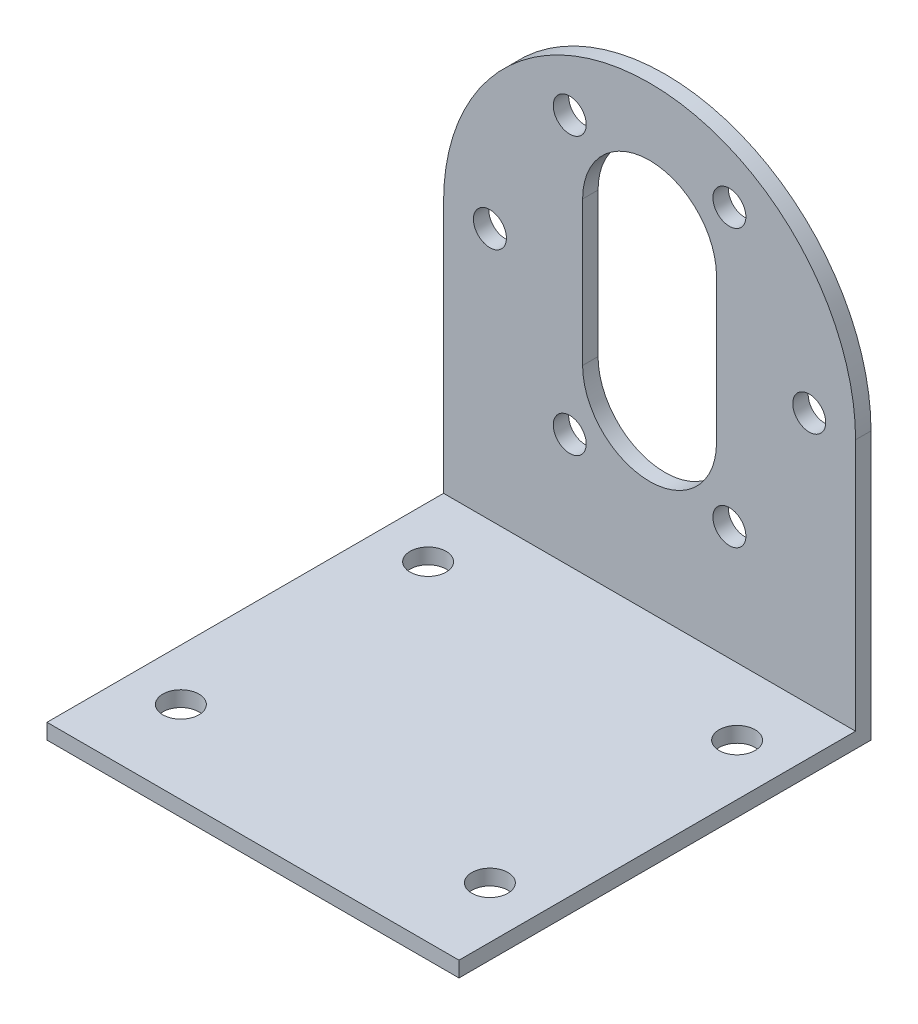
ISO-10303-21;
HEADER;
FILE_DESCRIPTION(('STEP AP214'),'2;1');
FILE_NAME('part.step','',(''),(''),'','','');
FILE_SCHEMA(('AUTOMOTIVE_DESIGN { 1 0 10303 214 1 1 1 1 }'));
ENDSEC;
DATA;
#1=APPLICATION_CONTEXT('core data for automotive mechanical design processes');
#2=APPLICATION_PROTOCOL_DEFINITION('international standard','automotive_design',2000,#1);
#3=PRODUCT_CONTEXT('',#1,'mechanical');
#4=PRODUCT('Part','Part','',(#3));
#5=PRODUCT_RELATED_PRODUCT_CATEGORY('part','',(#4));
#6=PRODUCT_DEFINITION_FORMATION('','',#4);
#7=PRODUCT_DEFINITION_CONTEXT('part definition',#1,'design');
#8=PRODUCT_DEFINITION('design','',#6,#7);
#9=PRODUCT_DEFINITION_SHAPE('','',#8);
#10=(LENGTH_UNIT() NAMED_UNIT(*) SI_UNIT(.MILLI.,.METRE.));
#11=(NAMED_UNIT(*) PLANE_ANGLE_UNIT() SI_UNIT($,.RADIAN.));
#12=(NAMED_UNIT(*) SI_UNIT($,.STERADIAN.) SOLID_ANGLE_UNIT());
#13=UNCERTAINTY_MEASURE_WITH_UNIT(LENGTH_MEASURE(1.E-05),#10,'distance_accuracy_value','');
#14=(GEOMETRIC_REPRESENTATION_CONTEXT(3) GLOBAL_UNCERTAINTY_ASSIGNED_CONTEXT((#13)) GLOBAL_UNIT_ASSIGNED_CONTEXT((#10,
#11,#12)) REPRESENTATION_CONTEXT('',''));
#15=CARTESIAN_POINT('',(0.,0.,0.));
#16=DIRECTION('',(0.,0.,1.));
#17=DIRECTION('',(1.,0.,0.));
#18=AXIS2_PLACEMENT_3D('',#15,#16,#17);
#19=CARTESIAN_POINT('',(0.,13.,1.5));
#20=DIRECTION('',(0.,0.,-1.));
#21=DIRECTION('',(-1.,0.,0.));
#22=AXIS2_PLACEMENT_3D('',#19,#20,#21);
#23=PLANE('',#22);
#24=CARTESIAN_POINT('',(-15.5,13.,1.5));
#25=DIRECTION('',(0.,0.,1.));
#26=DIRECTION('',(1.,0.,0.));
#27=AXIS2_PLACEMENT_3D('',#24,#25,#26);
#28=CIRCLE('',#27,1.6);
#29=CARTESIAN_POINT('',(-13.9,13.,1.5));
#30=VERTEX_POINT('',#29);
#31=EDGE_CURVE('E12',#30,#30,#28,.T.);
#32=ORIENTED_EDGE('',*,*,#31,.F.);
#33=EDGE_LOOP('',(#32));
#34=FACE_BOUND('',#33,.T.);
#35=CARTESIAN_POINT('',(-7.75,-0.423393758658798,1.5));
#36=DIRECTION('',(0.,0.,1.));
#37=DIRECTION('',(1.,0.,0.));
#38=AXIS2_PLACEMENT_3D('',#35,#36,#37);
#39=CIRCLE('',#38,1.6);
#40=CARTESIAN_POINT('',(-6.15,-0.423393758658798,1.5));
#41=VERTEX_POINT('',#40);
#42=EDGE_CURVE('E56',#41,#41,#39,.T.);
#43=ORIENTED_EDGE('',*,*,#42,.F.);
#44=EDGE_LOOP('',(#43));
#45=FACE_BOUND('',#44,.T.);
#46=CARTESIAN_POINT('',(7.75,-0.423393758658802,1.5));
#47=DIRECTION('',(0.,0.,1.));
#48=DIRECTION('',(1.,0.,0.));
#49=AXIS2_PLACEMENT_3D('',#46,#47,#48);
#50=CIRCLE('',#49,1.6);
#51=CARTESIAN_POINT('',(9.35000000000001,-0.423393758658802,1.5));
#52=VERTEX_POINT('',#51);
#53=EDGE_CURVE('E342',#52,#52,#50,.T.);
#54=ORIENTED_EDGE('',*,*,#53,.F.);
#55=EDGE_LOOP('',(#54));
#56=FACE_BOUND('',#55,.T.);
#57=CARTESIAN_POINT('',(15.5,13.,1.5));
#58=DIRECTION('',(0.,0.,1.));
#59=DIRECTION('',(1.,0.,0.));
#60=AXIS2_PLACEMENT_3D('',#57,#58,#59);
#61=CIRCLE('',#60,1.6);
#62=CARTESIAN_POINT('',(17.1,13.,1.5));
#63=VERTEX_POINT('',#62);
#64=EDGE_CURVE('E347',#63,#63,#61,.T.);
#65=ORIENTED_EDGE('',*,*,#64,.F.);
#66=EDGE_LOOP('',(#65));
#67=FACE_BOUND('',#66,.T.);
#68=CARTESIAN_POINT('',(7.75,26.4233937586588,1.5));
#69=DIRECTION('',(0.,0.,1.));
#70=DIRECTION('',(1.,0.,0.));
#71=AXIS2_PLACEMENT_3D('',#68,#69,#70);
#72=CIRCLE('',#71,1.6);
#73=CARTESIAN_POINT('',(9.35,26.4233937586588,1.5));
#74=VERTEX_POINT('',#73);
#75=EDGE_CURVE('E238',#74,#74,#72,.T.);
#76=ORIENTED_EDGE('',*,*,#75,.F.);
#77=EDGE_LOOP('',(#76));
#78=FACE_BOUND('',#77,.T.);
#79=CARTESIAN_POINT('',(-7.75,26.4233937586588,1.5));
#80=DIRECTION('',(0.,0.,1.));
#81=DIRECTION('',(1.,0.,0.));
#82=AXIS2_PLACEMENT_3D('',#79,#80,#81);
#83=CIRCLE('',#82,1.6);
#84=CARTESIAN_POINT('',(-6.15,26.4233937586588,1.5));
#85=VERTEX_POINT('',#84);
#86=EDGE_CURVE('E234',#85,#85,#83,.T.);
#87=ORIENTED_EDGE('',*,*,#86,.F.);
#88=EDGE_LOOP('',(#87));
#89=FACE_BOUND('',#88,.T.);
#90=DIRECTION('',(0.,-1.,0.));
#91=VECTOR('',#90,1.);
#92=CARTESIAN_POINT('',(-20.,13.,1.5));
#93=LINE('',#92,#91);
#94=CARTESIAN_POINT('',(-20.,13.,1.5));
#95=VERTEX_POINT('',#94);
#96=CARTESIAN_POINT('',(-20.,-11.5,1.5));
#97=VERTEX_POINT('',#96);
#98=EDGE_CURVE('E63',#95,#97,#93,.T.);
#99=ORIENTED_EDGE('',*,*,#98,.T.);
#100=DIRECTION('',(1.,0.,0.));
#101=VECTOR('',#100,1.);
#102=CARTESIAN_POINT('',(0.,-11.5,1.5));
#103=LINE('',#102,#101);
#104=CARTESIAN_POINT('',(20.,-11.5,1.5));
#105=VERTEX_POINT('',#104);
#106=EDGE_CURVE('E68',#97,#105,#103,.T.);
#107=ORIENTED_EDGE('',*,*,#106,.T.);
#108=DIRECTION('',(0.,1.,0.));
#109=VECTOR('',#108,1.);
#110=CARTESIAN_POINT('',(20.,13.,1.5));
#111=LINE('',#110,#109);
#112=CARTESIAN_POINT('',(20.,13.,1.5));
#113=VERTEX_POINT('',#112);
#114=EDGE_CURVE('E132',#105,#113,#111,.T.);
#115=ORIENTED_EDGE('',*,*,#114,.T.);
#116=CARTESIAN_POINT('',(0.,13.,1.5));
#117=DIRECTION('',(0.,0.,1.));
#118=DIRECTION('',(-1.,0.,0.));
#119=AXIS2_PLACEMENT_3D('',#116,#117,#118);
#120=CIRCLE('',#119,20.);
#121=EDGE_CURVE('E185',#113,#95,#120,.T.);
#122=ORIENTED_EDGE('',*,*,#121,.T.);
#123=EDGE_LOOP('',(#99,#107,#115,#122));
#124=FACE_BOUND('',#123,.T.);
#125=CARTESIAN_POINT('',(0.,6.,1.5));
#126=DIRECTION('',(0.,0.,1.));
#127=DIRECTION('',(-1.,0.,0.));
#128=AXIS2_PLACEMENT_3D('',#125,#126,#127);
#129=CIRCLE('',#128,6.5);
#130=CARTESIAN_POINT('',(-6.5,6.,1.5));
#131=VERTEX_POINT('',#130);
#132=CARTESIAN_POINT('',(6.5,6.,1.5));
#133=VERTEX_POINT('',#132);
#134=EDGE_CURVE('E250',#131,#133,#129,.T.);
#135=ORIENTED_EDGE('',*,*,#134,.F.);
#136=DIRECTION('',(0.,-1.,0.));
#137=VECTOR('',#136,1.);
#138=CARTESIAN_POINT('',(-6.5,20.,1.5));
#139=LINE('',#138,#137);
#140=CARTESIAN_POINT('',(-6.5,20.,1.5));
#141=VERTEX_POINT('',#140);
#142=EDGE_CURVE('E255',#141,#131,#139,.T.);
#143=ORIENTED_EDGE('',*,*,#142,.F.);
#144=CARTESIAN_POINT('',(0.,20.,1.5));
#145=DIRECTION('',(0.,0.,1.));
#146=DIRECTION('',(-1.,0.,0.));
#147=AXIS2_PLACEMENT_3D('',#144,#145,#146);
#148=CIRCLE('',#147,6.5);
#149=CARTESIAN_POINT('',(6.5,20.,1.5));
#150=VERTEX_POINT('',#149);
#151=EDGE_CURVE('E259',#150,#141,#148,.T.);
#152=ORIENTED_EDGE('',*,*,#151,.F.);
#153=DIRECTION('',(0.,1.,0.));
#154=VECTOR('',#153,1.);
#155=CARTESIAN_POINT('',(6.5,20.,1.5));
#156=LINE('',#155,#154);
#157=EDGE_CURVE('E263',#133,#150,#156,.T.);
#158=ORIENTED_EDGE('',*,*,#157,.F.);
#159=EDGE_LOOP('',(#135,#143,#152,#158));
#160=FACE_BOUND('',#159,.T.);
#161=ADVANCED_FACE('F47',(#34,#45,#56,#67,#78,#89,#124,#160),#23,.F.);
#162=CARTESIAN_POINT('',(0.,13.,0.));
#163=DIRECTION('',(0.,0.,-1.));
#164=DIRECTION('',(-1.,0.,0.));
#165=AXIS2_PLACEMENT_3D('',#162,#163,#164);
#166=PLANE('',#165);
#167=CARTESIAN_POINT('',(0.,13.,0.));
#168=DIRECTION('',(0.,0.,1.));
#169=DIRECTION('',(-1.,0.,0.));
#170=AXIS2_PLACEMENT_3D('',#167,#168,#169);
#171=CIRCLE('',#170,20.);
#172=CARTESIAN_POINT('',(20.,13.,0.));
#173=VERTEX_POINT('',#172);
#174=CARTESIAN_POINT('',(-20.,13.,0.));
#175=VERTEX_POINT('',#174);
#176=EDGE_CURVE('E266',#173,#175,#171,.T.);
#177=ORIENTED_EDGE('',*,*,#176,.F.);
#178=DIRECTION('',(0.,1.,0.));
#179=VECTOR('',#178,1.);
#180=CARTESIAN_POINT('',(20.,13.,0.));
#181=LINE('',#180,#179);
#182=CARTESIAN_POINT('',(20.,-13.,0.));
#183=VERTEX_POINT('',#182);
#184=EDGE_CURVE('E271',#183,#173,#181,.T.);
#185=ORIENTED_EDGE('',*,*,#184,.F.);
#186=DIRECTION('',(1.,0.,0.));
#187=VECTOR('',#186,1.);
#188=CARTESIAN_POINT('',(20.,-13.,0.));
#189=LINE('',#188,#187);
#190=CARTESIAN_POINT('',(-20.,-13.,0.));
#191=VERTEX_POINT('',#190);
#192=EDGE_CURVE('E322',#191,#183,#189,.T.);
#193=ORIENTED_EDGE('',*,*,#192,.F.);
#194=DIRECTION('',(0.,-1.,0.));
#195=VECTOR('',#194,1.);
#196=CARTESIAN_POINT('',(-20.,13.,0.));
#197=LINE('',#196,#195);
#198=EDGE_CURVE('E286',#175,#191,#197,.T.);
#199=ORIENTED_EDGE('',*,*,#198,.F.);
#200=EDGE_LOOP('',(#177,#185,#193,#199));
#201=FACE_BOUND('',#200,.T.);
#202=CARTESIAN_POINT('',(-7.75,-0.423393758658798,0.));
#203=DIRECTION('',(0.,0.,1.));
#204=DIRECTION('',(1.,0.,0.));
#205=AXIS2_PLACEMENT_3D('',#202,#203,#204);
#206=CIRCLE('',#205,1.6);
#207=CARTESIAN_POINT('',(-6.15,-0.423393758658798,0.));
#208=VERTEX_POINT('',#207);
#209=EDGE_CURVE('E281',#208,#208,#206,.T.);
#210=ORIENTED_EDGE('',*,*,#209,.T.);
#211=EDGE_LOOP('',(#210));
#212=FACE_BOUND('',#211,.T.);
#213=CARTESIAN_POINT('',(15.5,13.,0.));
#214=DIRECTION('',(0.,0.,1.));
#215=DIRECTION('',(1.,0.,0.));
#216=AXIS2_PLACEMENT_3D('',#213,#214,#215);
#217=CIRCLE('',#216,1.6);
#218=CARTESIAN_POINT('',(17.1,13.,0.));
#219=VERTEX_POINT('',#218);
#220=EDGE_CURVE('E287',#219,#219,#217,.T.);
#221=ORIENTED_EDGE('',*,*,#220,.T.);
#222=EDGE_LOOP('',(#221));
#223=FACE_BOUND('',#222,.T.);
#224=CARTESIAN_POINT('',(-7.75,26.4233937586588,0.));
#225=DIRECTION('',(0.,0.,1.));
#226=DIRECTION('',(1.,0.,0.));
#227=AXIS2_PLACEMENT_3D('',#224,#225,#226);
#228=CIRCLE('',#227,1.6);
#229=CARTESIAN_POINT('',(-6.15,26.4233937586588,0.));
#230=VERTEX_POINT('',#229);
#231=EDGE_CURVE('E297',#230,#230,#228,.T.);
#232=ORIENTED_EDGE('',*,*,#231,.T.);
#233=EDGE_LOOP('',(#232));
#234=FACE_BOUND('',#233,.T.);
#235=CARTESIAN_POINT('',(7.75,26.4233937586588,0.));
#236=DIRECTION('',(0.,0.,1.));
#237=DIRECTION('',(1.,0.,0.));
#238=AXIS2_PLACEMENT_3D('',#235,#236,#237);
#239=CIRCLE('',#238,1.6);
#240=CARTESIAN_POINT('',(9.35,26.4233937586588,0.));
#241=VERTEX_POINT('',#240);
#242=EDGE_CURVE('E301',#241,#241,#239,.T.);
#243=ORIENTED_EDGE('',*,*,#242,.T.);
#244=EDGE_LOOP('',(#243));
#245=FACE_BOUND('',#244,.T.);
#246=CARTESIAN_POINT('',(7.75,-0.423393758658802,0.));
#247=DIRECTION('',(0.,0.,1.));
#248=DIRECTION('',(1.,0.,0.));
#249=AXIS2_PLACEMENT_3D('',#246,#247,#248);
#250=CIRCLE('',#249,1.6);
#251=CARTESIAN_POINT('',(9.35000000000001,-0.423393758658802,0.));
#252=VERTEX_POINT('',#251);
#253=EDGE_CURVE('E309',#252,#252,#250,.T.);
#254=ORIENTED_EDGE('',*,*,#253,.T.);
#255=EDGE_LOOP('',(#254));
#256=FACE_BOUND('',#255,.T.);
#257=CARTESIAN_POINT('',(-15.5,13.,0.));
#258=DIRECTION('',(0.,0.,1.));
#259=DIRECTION('',(1.,0.,0.));
#260=AXIS2_PLACEMENT_3D('',#257,#258,#259);
#261=CIRCLE('',#260,1.6);
#262=CARTESIAN_POINT('',(-13.9,13.,0.));
#263=VERTEX_POINT('',#262);
#264=EDGE_CURVE('E313',#263,#263,#261,.T.);
#265=ORIENTED_EDGE('',*,*,#264,.T.);
#266=EDGE_LOOP('',(#265));
#267=FACE_BOUND('',#266,.T.);
#268=DIRECTION('',(0.,-1.,0.));
#269=VECTOR('',#268,1.);
#270=CARTESIAN_POINT('',(-6.5,20.,0.));
#271=LINE('',#270,#269);
#272=CARTESIAN_POINT('',(-6.5,20.,0.));
#273=VERTEX_POINT('',#272);
#274=CARTESIAN_POINT('',(-6.5,6.,0.));
#275=VERTEX_POINT('',#274);
#276=EDGE_CURVE('E205',#273,#275,#271,.T.);
#277=ORIENTED_EDGE('',*,*,#276,.T.);
#278=CARTESIAN_POINT('',(0.,6.,0.));
#279=DIRECTION('',(0.,0.,1.));
#280=DIRECTION('',(-1.,0.,0.));
#281=AXIS2_PLACEMENT_3D('',#278,#279,#280);
#282=CIRCLE('',#281,6.5);
#283=CARTESIAN_POINT('',(6.5,6.,0.));
#284=VERTEX_POINT('',#283);
#285=EDGE_CURVE('E197',#275,#284,#282,.T.);
#286=ORIENTED_EDGE('',*,*,#285,.T.);
#287=DIRECTION('',(0.,1.,0.));
#288=VECTOR('',#287,1.);
#289=CARTESIAN_POINT('',(6.5,20.,0.));
#290=LINE('',#289,#288);
#291=CARTESIAN_POINT('',(6.5,20.,0.));
#292=VERTEX_POINT('',#291);
#293=EDGE_CURVE('E193',#284,#292,#290,.T.);
#294=ORIENTED_EDGE('',*,*,#293,.T.);
#295=CARTESIAN_POINT('',(0.,20.,0.));
#296=DIRECTION('',(0.,0.,1.));
#297=DIRECTION('',(-1.,0.,0.));
#298=AXIS2_PLACEMENT_3D('',#295,#296,#297);
#299=CIRCLE('',#298,6.5);
#300=EDGE_CURVE('E198',#292,#273,#299,.T.);
#301=ORIENTED_EDGE('',*,*,#300,.T.);
#302=EDGE_LOOP('',(#277,#286,#294,#301));
#303=FACE_BOUND('',#302,.T.);
#304=ADVANCED_FACE('F369',(#201,#212,#223,#234,#245,#256,#267,#303),#166,.T.);
#305=CARTESIAN_POINT('',(-20.,13.,1.5));
#306=DIRECTION('',(1.,0.,0.));
#307=DIRECTION('',(0.,1.,0.));
#308=AXIS2_PLACEMENT_3D('',#305,#306,#307);
#309=PLANE('',#308);
#310=ORIENTED_EDGE('',*,*,#198,.T.);
#311=DIRECTION('',(0.,0.,-1.));
#312=VECTOR('',#311,1.);
#313=CARTESIAN_POINT('',(-20.,-13.,1.5));
#314=LINE('',#313,#312);
#315=CARTESIAN_POINT('',(-20.,-13.,40.));
#316=VERTEX_POINT('',#315);
#317=EDGE_CURVE('E516',#316,#191,#314,.T.);
#318=ORIENTED_EDGE('',*,*,#317,.F.);
#319=DIRECTION('',(0.,-1.,0.));
#320=VECTOR('',#319,1.);
#321=CARTESIAN_POINT('',(-20.,-11.5,40.));
#322=LINE('',#321,#320);
#323=CARTESIAN_POINT('',(-20.,-11.5,40.));
#324=VERTEX_POINT('',#323);
#325=EDGE_CURVE('E524',#324,#316,#322,.T.);
#326=ORIENTED_EDGE('',*,*,#325,.F.);
#327=DIRECTION('',(0.,0.,-1.));
#328=VECTOR('',#327,1.);
#329=CARTESIAN_POINT('',(-20.,-11.5,0.));
#330=LINE('',#329,#328);
#331=EDGE_CURVE('E141',#324,#97,#330,.T.);
#332=ORIENTED_EDGE('',*,*,#331,.T.);
#333=ORIENTED_EDGE('',*,*,#98,.F.);
#334=DIRECTION('',(0.,0.,-1.));
#335=VECTOR('',#334,1.);
#336=CARTESIAN_POINT('',(-20.,13.,1.5));
#337=LINE('',#336,#335);
#338=EDGE_CURVE('E538',#95,#175,#337,.T.);
#339=ORIENTED_EDGE('',*,*,#338,.T.);
#340=EDGE_LOOP('',(#310,#318,#326,#332,#333,#339));
#341=FACE_BOUND('',#340,.T.);
#342=ADVANCED_FACE('F460',(#341),#309,.F.);
#343=CARTESIAN_POINT('',(20.,-13.,1.5));
#344=DIRECTION('',(0.,1.,0.));
#345=DIRECTION('',(-1.,0.,0.));
#346=AXIS2_PLACEMENT_3D('',#343,#344,#345);
#347=PLANE('',#346);
#348=CARTESIAN_POINT('',(-15.,-13.,8.));
#349=DIRECTION('',(0.,-1.,0.));
#350=DIRECTION('',(0.,0.,-1.));
#351=AXIS2_PLACEMENT_3D('',#348,#349,#350);
#352=CIRCLE('',#351,1.74999999999999);
#353=CARTESIAN_POINT('',(-15.,-13.,6.25000000000001));
#354=VERTEX_POINT('',#353);
#355=EDGE_CURVE('E1058',#354,#354,#352,.T.);
#356=ORIENTED_EDGE('',*,*,#355,.F.);
#357=EDGE_LOOP('',(#356));
#358=FACE_BOUND('',#357,.T.);
#359=ORIENTED_EDGE('',*,*,#192,.T.);
#360=DIRECTION('',(0.,0.,-1.));
#361=VECTOR('',#360,1.);
#362=CARTESIAN_POINT('',(20.,-13.,1.5));
#363=LINE('',#362,#361);
#364=CARTESIAN_POINT('',(20.,-13.,40.));
#365=VERTEX_POINT('',#364);
#366=EDGE_CURVE('E220',#365,#183,#363,.T.);
#367=ORIENTED_EDGE('',*,*,#366,.F.);
#368=DIRECTION('',(-1.,0.,0.));
#369=VECTOR('',#368,1.);
#370=CARTESIAN_POINT('',(-20.,-13.,40.));
#371=LINE('',#370,#369);
#372=EDGE_CURVE('E150',#365,#316,#371,.T.);
#373=ORIENTED_EDGE('',*,*,#372,.T.);
#374=ORIENTED_EDGE('',*,*,#317,.T.);
#375=EDGE_LOOP('',(#359,#367,#373,#374));
#376=FACE_BOUND('',#375,.T.);
#377=CARTESIAN_POINT('',(15.,-13.,8.));
#378=DIRECTION('',(0.,-1.,0.));
#379=DIRECTION('',(1.,0.,0.));
#380=AXIS2_PLACEMENT_3D('',#377,#378,#379);
#381=CIRCLE('',#380,1.75);
#382=CARTESIAN_POINT('',(16.75,-13.,8.));
#383=VERTEX_POINT('',#382);
#384=EDGE_CURVE('E221',#383,#383,#381,.T.);
#385=ORIENTED_EDGE('',*,*,#384,.F.);
#386=EDGE_LOOP('',(#385));
#387=FACE_BOUND('',#386,.T.);
#388=CARTESIAN_POINT('',(15.,-13.,32.));
#389=DIRECTION('',(0.,-1.,0.));
#390=DIRECTION('',(1.,0.,0.));
#391=AXIS2_PLACEMENT_3D('',#388,#389,#390);
#392=CIRCLE('',#391,1.75);
#393=CARTESIAN_POINT('',(16.75,-13.,32.));
#394=VERTEX_POINT('',#393);
#395=EDGE_CURVE('E166',#394,#394,#392,.T.);
#396=ORIENTED_EDGE('',*,*,#395,.F.);
#397=EDGE_LOOP('',(#396));
#398=FACE_BOUND('',#397,.T.);
#399=CARTESIAN_POINT('',(-15.,-13.,32.));
#400=DIRECTION('',(0.,-1.,0.));
#401=DIRECTION('',(1.,0.,0.));
#402=AXIS2_PLACEMENT_3D('',#399,#400,#401);
#403=CIRCLE('',#402,1.75);
#404=CARTESIAN_POINT('',(-13.25,-13.,32.));
#405=VERTEX_POINT('',#404);
#406=EDGE_CURVE('E135',#405,#405,#403,.T.);
#407=ORIENTED_EDGE('',*,*,#406,.F.);
#408=EDGE_LOOP('',(#407));
#409=FACE_BOUND('',#408,.T.);
#410=ADVANCED_FACE('F457',(#358,#376,#387,#398,#409),#347,.F.);
#411=CARTESIAN_POINT('',(20.,13.,1.5));
#412=DIRECTION('',(-1.,0.,0.));
#413=DIRECTION('',(0.,-1.,0.));
#414=AXIS2_PLACEMENT_3D('',#411,#412,#413);
#415=PLANE('',#414);
#416=ORIENTED_EDGE('',*,*,#114,.F.);
#417=DIRECTION('',(0.,0.,1.));
#418=VECTOR('',#417,1.);
#419=CARTESIAN_POINT('',(20.,-11.5,0.));
#420=LINE('',#419,#418);
#421=CARTESIAN_POINT('',(20.,-11.5,40.));
#422=VERTEX_POINT('',#421);
#423=EDGE_CURVE('E124',#105,#422,#420,.T.);
#424=ORIENTED_EDGE('',*,*,#423,.T.);
#425=DIRECTION('',(0.,-1.,0.));
#426=VECTOR('',#425,1.);
#427=CARTESIAN_POINT('',(20.,-11.5,40.));
#428=LINE('',#427,#426);
#429=EDGE_CURVE('E129',#422,#365,#428,.T.);
#430=ORIENTED_EDGE('',*,*,#429,.T.);
#431=ORIENTED_EDGE('',*,*,#366,.T.);
#432=ORIENTED_EDGE('',*,*,#184,.T.);
#433=DIRECTION('',(0.,0.,-1.));
#434=VECTOR('',#433,1.);
#435=CARTESIAN_POINT('',(20.,13.,1.5));
#436=LINE('',#435,#434);
#437=EDGE_CURVE('E152',#113,#173,#436,.T.);
#438=ORIENTED_EDGE('',*,*,#437,.F.);
#439=EDGE_LOOP('',(#416,#424,#430,#431,#432,#438));
#440=FACE_BOUND('',#439,.T.);
#441=ADVANCED_FACE('F126',(#440),#415,.F.);
#442=CARTESIAN_POINT('',(0.,13.,1.5));
#443=DIRECTION('',(0.,0.,-1.));
#444=DIRECTION('',(-1.,0.,0.));
#445=AXIS2_PLACEMENT_3D('',#442,#443,#444);
#446=CYLINDRICAL_SURFACE('',#445,20.);
#447=ORIENTED_EDGE('',*,*,#176,.T.);
#448=ORIENTED_EDGE('',*,*,#338,.F.);
#449=ORIENTED_EDGE('',*,*,#121,.F.);
#450=ORIENTED_EDGE('',*,*,#437,.T.);
#451=EDGE_LOOP('',(#447,#448,#449,#450));
#452=FACE_BOUND('',#451,.T.);
#453=ADVANCED_FACE('F450',(#452),#446,.T.);
#454=CARTESIAN_POINT('',(-7.75,26.4233937586588,1.5));
#455=DIRECTION('',(0.,0.,-1.));
#456=DIRECTION('',(-1.,0.,0.));
#457=AXIS2_PLACEMENT_3D('',#454,#455,#456);
#458=CYLINDRICAL_SURFACE('',#457,1.6);
#459=ORIENTED_EDGE('',*,*,#86,.T.);
#460=EDGE_LOOP('',(#459));
#461=FACE_BOUND('',#460,.T.);
#462=ORIENTED_EDGE('',*,*,#231,.F.);
#463=EDGE_LOOP('',(#462));
#464=FACE_BOUND('',#463,.T.);
#465=ADVANCED_FACE('F447',(#461,#464),#458,.F.);
#466=CARTESIAN_POINT('',(7.75,26.4233937586588,1.5));
#467=DIRECTION('',(0.,0.,-1.));
#468=DIRECTION('',(-1.,0.,0.));
#469=AXIS2_PLACEMENT_3D('',#466,#467,#468);
#470=CYLINDRICAL_SURFACE('',#469,1.6);
#471=ORIENTED_EDGE('',*,*,#75,.T.);
#472=EDGE_LOOP('',(#471));
#473=FACE_BOUND('',#472,.T.);
#474=ORIENTED_EDGE('',*,*,#242,.F.);
#475=EDGE_LOOP('',(#474));
#476=FACE_BOUND('',#475,.T.);
#477=ADVANCED_FACE('F364',(#473,#476),#470,.F.);
#478=CARTESIAN_POINT('',(15.5,13.,1.5));
#479=DIRECTION('',(0.,0.,-1.));
#480=DIRECTION('',(-1.,0.,0.));
#481=AXIS2_PLACEMENT_3D('',#478,#479,#480);
#482=CYLINDRICAL_SURFACE('',#481,1.6);
#483=ORIENTED_EDGE('',*,*,#64,.T.);
#484=EDGE_LOOP('',(#483));
#485=FACE_BOUND('',#484,.T.);
#486=ORIENTED_EDGE('',*,*,#220,.F.);
#487=EDGE_LOOP('',(#486));
#488=FACE_BOUND('',#487,.T.);
#489=ADVANCED_FACE('F441',(#485,#488),#482,.F.);
#490=CARTESIAN_POINT('',(7.75,-0.423393758658802,1.5));
#491=DIRECTION('',(0.,0.,-1.));
#492=DIRECTION('',(-1.,0.,0.));
#493=AXIS2_PLACEMENT_3D('',#490,#491,#492);
#494=CYLINDRICAL_SURFACE('',#493,1.6);
#495=ORIENTED_EDGE('',*,*,#53,.T.);
#496=EDGE_LOOP('',(#495));
#497=FACE_BOUND('',#496,.T.);
#498=ORIENTED_EDGE('',*,*,#253,.F.);
#499=EDGE_LOOP('',(#498));
#500=FACE_BOUND('',#499,.T.);
#501=ADVANCED_FACE('F434',(#497,#500),#494,.F.);
#502=CARTESIAN_POINT('',(-7.75,-0.423393758658798,1.5));
#503=DIRECTION('',(0.,0.,-1.));
#504=DIRECTION('',(-1.,0.,0.));
#505=AXIS2_PLACEMENT_3D('',#502,#503,#504);
#506=CYLINDRICAL_SURFACE('',#505,1.6);
#507=ORIENTED_EDGE('',*,*,#42,.T.);
#508=EDGE_LOOP('',(#507));
#509=FACE_BOUND('',#508,.T.);
#510=ORIENTED_EDGE('',*,*,#209,.F.);
#511=EDGE_LOOP('',(#510));
#512=FACE_BOUND('',#511,.T.);
#513=ADVANCED_FACE('F426',(#509,#512),#506,.F.);
#514=CARTESIAN_POINT('',(-15.5,13.,1.5));
#515=DIRECTION('',(0.,0.,-1.));
#516=DIRECTION('',(-1.,0.,0.));
#517=AXIS2_PLACEMENT_3D('',#514,#515,#516);
#518=CYLINDRICAL_SURFACE('',#517,1.6);
#519=ORIENTED_EDGE('',*,*,#31,.T.);
#520=EDGE_LOOP('',(#519));
#521=FACE_BOUND('',#520,.T.);
#522=ORIENTED_EDGE('',*,*,#264,.F.);
#523=EDGE_LOOP('',(#522));
#524=FACE_BOUND('',#523,.T.);
#525=ADVANCED_FACE('F424',(#521,#524),#518,.F.);
#526=CARTESIAN_POINT('',(0.,6.,1.5));
#527=DIRECTION('',(0.,0.,-1.));
#528=DIRECTION('',(-1.,0.,0.));
#529=AXIS2_PLACEMENT_3D('',#526,#527,#528);
#530=CYLINDRICAL_SURFACE('',#529,6.5);
#531=ORIENTED_EDGE('',*,*,#285,.F.);
#532=DIRECTION('',(0.,0.,-1.));
#533=VECTOR('',#532,1.);
#534=CARTESIAN_POINT('',(-6.5,6.,1.5));
#535=LINE('',#534,#533);
#536=EDGE_CURVE('E158',#131,#275,#535,.T.);
#537=ORIENTED_EDGE('',*,*,#536,.F.);
#538=ORIENTED_EDGE('',*,*,#134,.T.);
#539=DIRECTION('',(0.,0.,-1.));
#540=VECTOR('',#539,1.);
#541=CARTESIAN_POINT('',(6.5,6.,1.5));
#542=LINE('',#541,#540);
#543=EDGE_CURVE('E383',#133,#284,#542,.T.);
#544=ORIENTED_EDGE('',*,*,#543,.T.);
#545=EDGE_LOOP('',(#531,#537,#538,#544));
#546=FACE_BOUND('',#545,.T.);
#547=ADVANCED_FACE('F379',(#546),#530,.F.);
#548=CARTESIAN_POINT('',(6.5,20.,1.5));
#549=DIRECTION('',(-1.,0.,0.));
#550=DIRECTION('',(0.,-1.,0.));
#551=AXIS2_PLACEMENT_3D('',#548,#549,#550);
#552=PLANE('',#551);
#553=ORIENTED_EDGE('',*,*,#293,.F.);
#554=ORIENTED_EDGE('',*,*,#543,.F.);
#555=ORIENTED_EDGE('',*,*,#157,.T.);
#556=DIRECTION('',(0.,0.,-1.));
#557=VECTOR('',#556,1.);
#558=CARTESIAN_POINT('',(6.5,20.,1.5));
#559=LINE('',#558,#557);
#560=EDGE_CURVE('E391',#150,#292,#559,.T.);
#561=ORIENTED_EDGE('',*,*,#560,.T.);
#562=EDGE_LOOP('',(#553,#554,#555,#561));
#563=FACE_BOUND('',#562,.T.);
#564=ADVANCED_FACE('F411',(#563),#552,.T.);
#565=CARTESIAN_POINT('',(0.,20.,1.5));
#566=DIRECTION('',(0.,0.,-1.));
#567=DIRECTION('',(-1.,0.,0.));
#568=AXIS2_PLACEMENT_3D('',#565,#566,#567);
#569=CYLINDRICAL_SURFACE('',#568,6.5);
#570=ORIENTED_EDGE('',*,*,#300,.F.);
#571=ORIENTED_EDGE('',*,*,#560,.F.);
#572=ORIENTED_EDGE('',*,*,#151,.T.);
#573=DIRECTION('',(0.,0.,-1.));
#574=VECTOR('',#573,1.);
#575=CARTESIAN_POINT('',(-6.5,20.,1.5));
#576=LINE('',#575,#574);
#577=EDGE_CURVE('E387',#141,#273,#576,.T.);
#578=ORIENTED_EDGE('',*,*,#577,.T.);
#579=EDGE_LOOP('',(#570,#571,#572,#578));
#580=FACE_BOUND('',#579,.T.);
#581=ADVANCED_FACE('F752',(#580),#569,.F.);
#582=CARTESIAN_POINT('',(-6.5,20.,1.5));
#583=DIRECTION('',(1.,0.,0.));
#584=DIRECTION('',(0.,1.,0.));
#585=AXIS2_PLACEMENT_3D('',#582,#583,#584);
#586=PLANE('',#585);
#587=ORIENTED_EDGE('',*,*,#276,.F.);
#588=ORIENTED_EDGE('',*,*,#577,.F.);
#589=ORIENTED_EDGE('',*,*,#142,.T.);
#590=ORIENTED_EDGE('',*,*,#536,.T.);
#591=EDGE_LOOP('',(#587,#588,#589,#590));
#592=FACE_BOUND('',#591,.T.);
#593=ADVANCED_FACE('F385',(#592),#586,.T.);
#594=CARTESIAN_POINT('',(0.,-11.5,0.));
#595=DIRECTION('',(0.,1.,0.));
#596=DIRECTION('',(-1.,0.,0.));
#597=AXIS2_PLACEMENT_3D('',#594,#595,#596);
#598=PLANE('',#597);
#599=CARTESIAN_POINT('',(-15.,-11.5,8.));
#600=DIRECTION('',(0.,1.,0.));
#601=DIRECTION('',(-1.,0.,0.));
#602=AXIS2_PLACEMENT_3D('',#599,#600,#601);
#603=CIRCLE('',#602,1.74999999999999);
#604=CARTESIAN_POINT('',(-16.75,-11.5,8.));
#605=VERTEX_POINT('',#604);
#606=EDGE_CURVE('E146',#605,#605,#603,.T.);
#607=ORIENTED_EDGE('',*,*,#606,.F.);
#608=EDGE_LOOP('',(#607));
#609=FACE_BOUND('',#608,.T.);
#610=CARTESIAN_POINT('',(-15.,-11.5,32.));
#611=DIRECTION('',(0.,-1.,0.));
#612=DIRECTION('',(1.,0.,0.));
#613=AXIS2_PLACEMENT_3D('',#610,#611,#612);
#614=CIRCLE('',#613,1.75);
#615=CARTESIAN_POINT('',(-13.25,-11.5,32.));
#616=VERTEX_POINT('',#615);
#617=EDGE_CURVE('E392',#616,#616,#614,.T.);
#618=ORIENTED_EDGE('',*,*,#617,.T.);
#619=EDGE_LOOP('',(#618));
#620=FACE_BOUND('',#619,.T.);
#621=CARTESIAN_POINT('',(15.,-11.5,32.));
#622=DIRECTION('',(0.,-1.,0.));
#623=DIRECTION('',(1.,0.,0.));
#624=AXIS2_PLACEMENT_3D('',#621,#622,#623);
#625=CIRCLE('',#624,1.75);
#626=CARTESIAN_POINT('',(16.75,-11.5,32.));
#627=VERTEX_POINT('',#626);
#628=EDGE_CURVE('E401',#627,#627,#625,.T.);
#629=ORIENTED_EDGE('',*,*,#628,.T.);
#630=EDGE_LOOP('',(#629));
#631=FACE_BOUND('',#630,.T.);
#632=CARTESIAN_POINT('',(15.,-11.5,8.));
#633=DIRECTION('',(0.,-1.,0.));
#634=DIRECTION('',(1.,0.,0.));
#635=AXIS2_PLACEMENT_3D('',#632,#633,#634);
#636=CIRCLE('',#635,1.75);
#637=CARTESIAN_POINT('',(16.75,-11.5,8.));
#638=VERTEX_POINT('',#637);
#639=EDGE_CURVE('E145',#638,#638,#636,.T.);
#640=ORIENTED_EDGE('',*,*,#639,.T.);
#641=EDGE_LOOP('',(#640));
#642=FACE_BOUND('',#641,.T.);
#643=ORIENTED_EDGE('',*,*,#106,.F.);
#644=ORIENTED_EDGE('',*,*,#331,.F.);
#645=DIRECTION('',(-1.,0.,0.));
#646=VECTOR('',#645,1.);
#647=CARTESIAN_POINT('',(-20.,-11.5,40.));
#648=LINE('',#647,#646);
#649=EDGE_CURVE('E139',#422,#324,#648,.T.);
#650=ORIENTED_EDGE('',*,*,#649,.F.);
#651=ORIENTED_EDGE('',*,*,#423,.F.);
#652=EDGE_LOOP('',(#643,#644,#650,#651));
#653=FACE_BOUND('',#652,.T.);
#654=ADVANCED_FACE('F140',(#609,#620,#631,#642,#653),#598,.T.);
#655=CARTESIAN_POINT('',(-20.,-11.5,40.));
#656=DIRECTION('',(0.,0.,1.));
#657=DIRECTION('',(1.,0.,0.));
#658=AXIS2_PLACEMENT_3D('',#655,#656,#657);
#659=PLANE('',#658);
#660=ORIENTED_EDGE('',*,*,#372,.F.);
#661=ORIENTED_EDGE('',*,*,#429,.F.);
#662=ORIENTED_EDGE('',*,*,#649,.T.);
#663=ORIENTED_EDGE('',*,*,#325,.T.);
#664=EDGE_LOOP('',(#660,#661,#662,#663));
#665=FACE_BOUND('',#664,.T.);
#666=ADVANCED_FACE('F148',(#665),#659,.T.);
#667=CARTESIAN_POINT('',(-15.,-11.5,32.));
#668=DIRECTION('',(0.,-1.,0.));
#669=DIRECTION('',(1.,0.,0.));
#670=AXIS2_PLACEMENT_3D('',#667,#668,#669);
#671=CYLINDRICAL_SURFACE('',#670,1.75);
#672=ORIENTED_EDGE('',*,*,#617,.F.);
#673=EDGE_LOOP('',(#672));
#674=FACE_BOUND('',#673,.T.);
#675=ORIENTED_EDGE('',*,*,#406,.T.);
#676=EDGE_LOOP('',(#675));
#677=FACE_BOUND('',#676,.T.);
#678=ADVANCED_FACE('F797',(#674,#677),#671,.F.);
#679=CARTESIAN_POINT('',(15.,-11.5,32.));
#680=DIRECTION('',(0.,-1.,0.));
#681=DIRECTION('',(1.,0.,0.));
#682=AXIS2_PLACEMENT_3D('',#679,#680,#681);
#683=CYLINDRICAL_SURFACE('',#682,1.75);
#684=ORIENTED_EDGE('',*,*,#628,.F.);
#685=EDGE_LOOP('',(#684));
#686=FACE_BOUND('',#685,.T.);
#687=ORIENTED_EDGE('',*,*,#395,.T.);
#688=EDGE_LOOP('',(#687));
#689=FACE_BOUND('',#688,.T.);
#690=ADVANCED_FACE('F809',(#686,#689),#683,.F.);
#691=CARTESIAN_POINT('',(15.,-11.5,8.));
#692=DIRECTION('',(0.,-1.,0.));
#693=DIRECTION('',(1.,0.,0.));
#694=AXIS2_PLACEMENT_3D('',#691,#692,#693);
#695=CYLINDRICAL_SURFACE('',#694,1.75);
#696=ORIENTED_EDGE('',*,*,#639,.F.);
#697=EDGE_LOOP('',(#696));
#698=FACE_BOUND('',#697,.T.);
#699=ORIENTED_EDGE('',*,*,#384,.T.);
#700=EDGE_LOOP('',(#699));
#701=FACE_BOUND('',#700,.T.);
#702=ADVANCED_FACE('F822',(#698,#701),#695,.F.);
#703=CARTESIAN_POINT('',(-15.,-13.,8.));
#704=DIRECTION('',(0.,-1.,0.));
#705=DIRECTION('',(0.,0.,-1.));
#706=AXIS2_PLACEMENT_3D('',#703,#704,#705);
#707=CYLINDRICAL_SURFACE('',#706,1.74999999999999);
#708=ORIENTED_EDGE('',*,*,#606,.T.);
#709=EDGE_LOOP('',(#708));
#710=FACE_BOUND('',#709,.T.);
#711=ORIENTED_EDGE('',*,*,#355,.T.);
#712=EDGE_LOOP('',(#711));
#713=FACE_BOUND('',#712,.T.);
#714=ADVANCED_FACE('F834',(#710,#713),#707,.F.);
#715=CLOSED_SHELL('',(#161,#304,#342,#410,#441,#453,#465,#477,#489,#501,#513,#525,#547,#564,
#581,#593,#654,#666,#678,#690,#702,#714));
#716=MANIFOLD_SOLID_BREP('B2',#715);
#717=ADVANCED_BREP_SHAPE_REPRESENTATION('',(#18,#716),#14);
#718=SHAPE_DEFINITION_REPRESENTATION(#9,#717);
ENDSEC;
END-ISO-10303-21;
